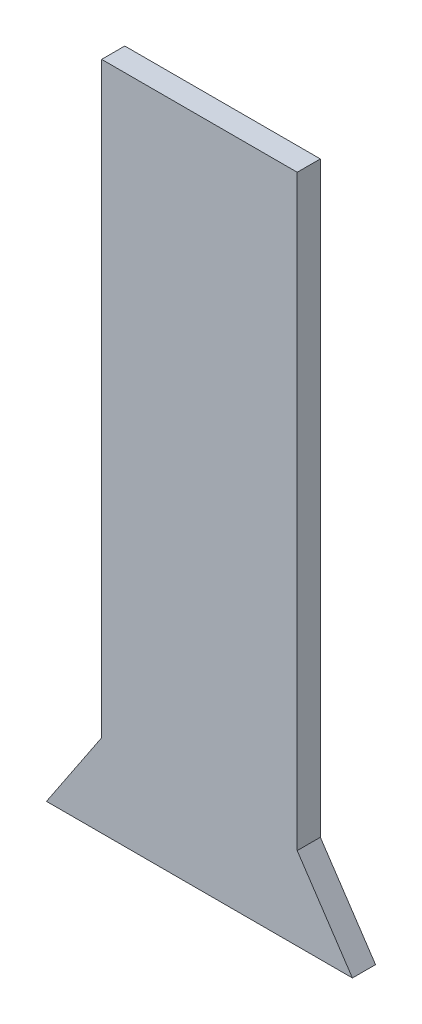
ISO-10303-21;
HEADER;
FILE_DESCRIPTION(('STEP AP214'),'2;1');
FILE_NAME('part.step','',(''),(''),'','','');
FILE_SCHEMA(('AUTOMOTIVE_DESIGN { 1 0 10303 214 1 1 1 1 }'));
ENDSEC;
DATA;
#1=APPLICATION_CONTEXT('core data for automotive mechanical design processes');
#2=APPLICATION_PROTOCOL_DEFINITION('international standard','automotive_design',2000,#1);
#3=PRODUCT_CONTEXT('',#1,'mechanical');
#4=PRODUCT('Part','Part','',(#3));
#5=PRODUCT_RELATED_PRODUCT_CATEGORY('part','',(#4));
#6=PRODUCT_DEFINITION_FORMATION('','',#4);
#7=PRODUCT_DEFINITION_CONTEXT('part definition',#1,'design');
#8=PRODUCT_DEFINITION('design','',#6,#7);
#9=PRODUCT_DEFINITION_SHAPE('','',#8);
#10=(LENGTH_UNIT() NAMED_UNIT(*) SI_UNIT(.MILLI.,.METRE.));
#11=(NAMED_UNIT(*) PLANE_ANGLE_UNIT() SI_UNIT($,.RADIAN.));
#12=(NAMED_UNIT(*) SI_UNIT($,.STERADIAN.) SOLID_ANGLE_UNIT());
#13=UNCERTAINTY_MEASURE_WITH_UNIT(LENGTH_MEASURE(1.E-05),#10,'distance_accuracy_value','');
#14=(GEOMETRIC_REPRESENTATION_CONTEXT(3) GLOBAL_UNCERTAINTY_ASSIGNED_CONTEXT((#13)) GLOBAL_UNIT_ASSIGNED_CONTEXT((#10,
#11,#12)) REPRESENTATION_CONTEXT('',''));
#15=CARTESIAN_POINT('',(0.,0.,0.));
#16=DIRECTION('',(0.,0.,1.));
#17=DIRECTION('',(1.,0.,0.));
#18=AXIS2_PLACEMENT_3D('',#15,#16,#17);
#19=CARTESIAN_POINT('',(2.0733173076923,2.28966346153846,0.5));
#20=DIRECTION('',(-0.831783322825491,-0.555100444847043,0.));
#21=DIRECTION('',(0.555100444847043,-0.831783322825491,0.));
#22=AXIS2_PLACEMENT_3D('',#19,#20,#21);
#23=PLANE('',#22);
#24=DIRECTION('',(0.555100444847043,-0.831783322825491,0.));
#25=VECTOR('',#24,1.);
#26=CARTESIAN_POINT('',(2.0733173076923,2.28966346153846,1.));
#27=LINE('',#26,#25);
#28=CARTESIAN_POINT('',(2.0733173076923,2.28966346153846,1.));
#29=VERTEX_POINT('',#28);
#30=CARTESIAN_POINT('',(3.26767039985561,0.5,1.));
#31=VERTEX_POINT('',#30);
#32=EDGE_CURVE('E43',#29,#31,#27,.T.);
#33=ORIENTED_EDGE('',*,*,#32,.T.);
#34=DIRECTION('',(0.,0.,-1.));
#35=VECTOR('',#34,1.);
#36=CARTESIAN_POINT('',(3.26767039985561,0.5,0.5));
#37=LINE('',#36,#35);
#38=CARTESIAN_POINT('',(3.26767039985561,0.5,0.5));
#39=VERTEX_POINT('',#38);
#40=EDGE_CURVE('E60',#31,#39,#37,.T.);
#41=ORIENTED_EDGE('',*,*,#40,.T.);
#42=DIRECTION('',(0.555100444847043,-0.831783322825491,0.));
#43=VECTOR('',#42,1.);
#44=CARTESIAN_POINT('',(2.0733173076923,2.28966346153846,0.5));
#45=LINE('',#44,#43);
#46=CARTESIAN_POINT('',(2.0733173076923,2.28966346153846,0.5));
#47=VERTEX_POINT('',#46);
#48=EDGE_CURVE('E106',#47,#39,#45,.T.);
#49=ORIENTED_EDGE('',*,*,#48,.F.);
#50=DIRECTION('',(0.,0.,1.));
#51=VECTOR('',#50,1.);
#52=CARTESIAN_POINT('',(2.0733173076923,2.28966346153846,0.5));
#53=LINE('',#52,#51);
#54=EDGE_CURVE('E103',#47,#29,#53,.T.);
#55=ORIENTED_EDGE('',*,*,#54,.T.);
#56=EDGE_LOOP('',(#33,#41,#49,#55));
#57=FACE_BOUND('',#56,.T.);
#58=ADVANCED_FACE('F39',(#57),#23,.F.);
#59=CARTESIAN_POINT('',(-13.6959134615385,-15.,0.5));
#60=DIRECTION('',(0.831783322825491,-0.555100444847043,0.));
#61=DIRECTION('',(0.555100444847043,0.831783322825491,0.));
#62=AXIS2_PLACEMENT_3D('',#59,#60,#61);
#63=PLANE('',#62);
#64=DIRECTION('',(0.555100444847043,0.831783322825491,0.));
#65=VECTOR('',#64,1.);
#66=CARTESIAN_POINT('',(-13.6959134615385,-15.,0.5));
#67=LINE('',#66,#65);
#68=CARTESIAN_POINT('',(-3.35180501524024,0.500000000000002,0.5));
#69=VERTEX_POINT('',#68);
#70=CARTESIAN_POINT('',(-2.15745192307693,2.28966346153846,0.5));
#71=VERTEX_POINT('',#70);
#72=EDGE_CURVE('E101',#69,#71,#67,.T.);
#73=ORIENTED_EDGE('',*,*,#72,.F.);
#74=DIRECTION('',(0.,0.,1.));
#75=VECTOR('',#74,1.);
#76=CARTESIAN_POINT('',(-3.35180501524024,0.499999999999999,0.5));
#77=LINE('',#76,#75);
#78=CARTESIAN_POINT('',(-3.35180501524024,0.5,1.));
#79=VERTEX_POINT('',#78);
#80=EDGE_CURVE('E88',#69,#79,#77,.T.);
#81=ORIENTED_EDGE('',*,*,#80,.T.);
#82=DIRECTION('',(0.555100444847043,0.831783322825491,0.));
#83=VECTOR('',#82,1.);
#84=CARTESIAN_POINT('',(-13.6959134615385,-15.,1.));
#85=LINE('',#84,#83);
#86=CARTESIAN_POINT('',(-2.15745192307693,2.28966346153846,1.));
#87=VERTEX_POINT('',#86);
#88=EDGE_CURVE('E104',#79,#87,#85,.T.);
#89=ORIENTED_EDGE('',*,*,#88,.T.);
#90=DIRECTION('',(0.,0.,1.));
#91=VECTOR('',#90,1.);
#92=CARTESIAN_POINT('',(-2.15745192307693,2.28966346153846,0.5));
#93=LINE('',#92,#91);
#94=EDGE_CURVE('E11',#71,#87,#93,.T.);
#95=ORIENTED_EDGE('',*,*,#94,.F.);
#96=EDGE_LOOP('',(#73,#81,#89,#95));
#97=FACE_BOUND('',#96,.T.);
#98=ADVANCED_FACE('F102',(#97),#63,.F.);
#99=CARTESIAN_POINT('',(1.37262654898482,-3.59519909686313,0.5));
#100=DIRECTION('',(0.,0.,1.));
#101=DIRECTION('',(1.,0.,0.));
#102=AXIS2_PLACEMENT_3D('',#99,#100,#101);
#103=PLANE('',#102);
#104=ORIENTED_EDGE('',*,*,#48,.T.);
#105=DIRECTION('',(-1.,0.,0.));
#106=VECTOR('',#105,1.);
#107=CARTESIAN_POINT('',(1.37262654898482,0.5,0.5));
#108=LINE('',#107,#106);
#109=EDGE_CURVE('E112',#39,#69,#108,.T.);
#110=ORIENTED_EDGE('',*,*,#109,.T.);
#111=ORIENTED_EDGE('',*,*,#72,.T.);
#112=DIRECTION('',(0.,1.,0.));
#113=VECTOR('',#112,1.);
#114=CARTESIAN_POINT('',(-2.15745192307693,2.28966346153846,0.5));
#115=LINE('',#114,#113);
#116=CARTESIAN_POINT('',(-2.15745192307693,15.,0.5));
#117=VERTEX_POINT('',#116);
#118=EDGE_CURVE('E114',#71,#117,#115,.T.);
#119=ORIENTED_EDGE('',*,*,#118,.T.);
#120=DIRECTION('',(1.,0.,0.));
#121=VECTOR('',#120,1.);
#122=CARTESIAN_POINT('',(-2.15745192307693,15.,0.5));
#123=LINE('',#122,#121);
#124=CARTESIAN_POINT('',(2.0733173076923,15.,0.5));
#125=VERTEX_POINT('',#124);
#126=EDGE_CURVE('E120',#117,#125,#123,.T.);
#127=ORIENTED_EDGE('',*,*,#126,.T.);
#128=DIRECTION('',(0.,-1.,0.));
#129=VECTOR('',#128,1.);
#130=CARTESIAN_POINT('',(2.0733173076923,15.,0.5));
#131=LINE('',#130,#129);
#132=EDGE_CURVE('E100',#125,#47,#131,.T.);
#133=ORIENTED_EDGE('',*,*,#132,.T.);
#134=EDGE_LOOP('',(#104,#110,#111,#119,#127,#133));
#135=FACE_BOUND('',#134,.T.);
#136=ADVANCED_FACE('F147',(#135),#103,.F.);
#137=CARTESIAN_POINT('',(1.37262654898482,-3.59519909686313,1.));
#138=DIRECTION('',(0.,0.,1.));
#139=DIRECTION('',(1.,0.,0.));
#140=AXIS2_PLACEMENT_3D('',#137,#138,#139);
#141=PLANE('',#140);
#142=ORIENTED_EDGE('',*,*,#88,.F.);
#143=DIRECTION('',(1.,0.,0.));
#144=VECTOR('',#143,1.);
#145=CARTESIAN_POINT('',(-17.,0.5,1.));
#146=LINE('',#145,#144);
#147=EDGE_CURVE('E89',#79,#31,#146,.T.);
#148=ORIENTED_EDGE('',*,*,#147,.T.);
#149=ORIENTED_EDGE('',*,*,#32,.F.);
#150=DIRECTION('',(0.,-1.,0.));
#151=VECTOR('',#150,1.);
#152=CARTESIAN_POINT('',(2.0733173076923,15.,1.));
#153=LINE('',#152,#151);
#154=CARTESIAN_POINT('',(2.0733173076923,15.,1.));
#155=VERTEX_POINT('',#154);
#156=EDGE_CURVE('E128',#155,#29,#153,.T.);
#157=ORIENTED_EDGE('',*,*,#156,.F.);
#158=DIRECTION('',(1.,0.,0.));
#159=VECTOR('',#158,1.);
#160=CARTESIAN_POINT('',(-2.15745192307693,15.,1.));
#161=LINE('',#160,#159);
#162=CARTESIAN_POINT('',(-2.15745192307693,15.,1.));
#163=VERTEX_POINT('',#162);
#164=EDGE_CURVE('E96',#163,#155,#161,.T.);
#165=ORIENTED_EDGE('',*,*,#164,.F.);
#166=DIRECTION('',(0.,1.,0.));
#167=VECTOR('',#166,1.);
#168=CARTESIAN_POINT('',(-2.15745192307693,2.28966346153846,1.));
#169=LINE('',#168,#167);
#170=EDGE_CURVE('E47',#87,#163,#169,.T.);
#171=ORIENTED_EDGE('',*,*,#170,.F.);
#172=EDGE_LOOP('',(#142,#148,#149,#157,#165,#171));
#173=FACE_BOUND('',#172,.T.);
#174=ADVANCED_FACE('F41',(#173),#141,.T.);
#175=CARTESIAN_POINT('',(-2.15745192307693,15.,0.5));
#176=DIRECTION('',(0.,-1.,0.));
#177=DIRECTION('',(0.,0.,-1.));
#178=AXIS2_PLACEMENT_3D('',#175,#176,#177);
#179=PLANE('',#178);
#180=ORIENTED_EDGE('',*,*,#164,.T.);
#181=DIRECTION('',(0.,0.,1.));
#182=VECTOR('',#181,1.);
#183=CARTESIAN_POINT('',(2.0733173076923,15.,0.5));
#184=LINE('',#183,#182);
#185=EDGE_CURVE('E126',#125,#155,#184,.T.);
#186=ORIENTED_EDGE('',*,*,#185,.F.);
#187=ORIENTED_EDGE('',*,*,#126,.F.);
#188=DIRECTION('',(0.,0.,1.));
#189=VECTOR('',#188,1.);
#190=CARTESIAN_POINT('',(-2.15745192307693,15.,0.5));
#191=LINE('',#190,#189);
#192=EDGE_CURVE('E124',#117,#163,#191,.T.);
#193=ORIENTED_EDGE('',*,*,#192,.T.);
#194=EDGE_LOOP('',(#180,#186,#187,#193));
#195=FACE_BOUND('',#194,.T.);
#196=ADVANCED_FACE('F141',(#195),#179,.F.);
#197=CARTESIAN_POINT('',(2.0733173076923,15.,0.5));
#198=DIRECTION('',(-1.,0.,0.));
#199=DIRECTION('',(0.,0.,1.));
#200=AXIS2_PLACEMENT_3D('',#197,#198,#199);
#201=PLANE('',#200);
#202=ORIENTED_EDGE('',*,*,#156,.T.);
#203=ORIENTED_EDGE('',*,*,#54,.F.);
#204=ORIENTED_EDGE('',*,*,#132,.F.);
#205=ORIENTED_EDGE('',*,*,#185,.T.);
#206=EDGE_LOOP('',(#202,#203,#204,#205));
#207=FACE_BOUND('',#206,.T.);
#208=ADVANCED_FACE('F140',(#207),#201,.F.);
#209=CARTESIAN_POINT('',(-2.15745192307693,2.28966346153846,0.5));
#210=DIRECTION('',(1.,0.,0.));
#211=DIRECTION('',(0.,0.,-1.));
#212=AXIS2_PLACEMENT_3D('',#209,#210,#211);
#213=PLANE('',#212);
#214=ORIENTED_EDGE('',*,*,#170,.T.);
#215=ORIENTED_EDGE('',*,*,#192,.F.);
#216=ORIENTED_EDGE('',*,*,#118,.F.);
#217=ORIENTED_EDGE('',*,*,#94,.T.);
#218=EDGE_LOOP('',(#214,#215,#216,#217));
#219=FACE_BOUND('',#218,.T.);
#220=ADVANCED_FACE('F146',(#219),#213,.F.);
#221=CARTESIAN_POINT('',(-17.,0.5,1.));
#222=DIRECTION('',(0.,1.,0.));
#223=DIRECTION('',(0.,0.,1.));
#224=AXIS2_PLACEMENT_3D('',#221,#222,#223);
#225=PLANE('',#224);
#226=ORIENTED_EDGE('',*,*,#147,.F.);
#227=ORIENTED_EDGE('',*,*,#80,.F.);
#228=ORIENTED_EDGE('',*,*,#109,.F.);
#229=ORIENTED_EDGE('',*,*,#40,.F.);
#230=EDGE_LOOP('',(#226,#227,#228,#229));
#231=FACE_BOUND('',#230,.T.);
#232=ADVANCED_FACE('F91',(#231),#225,.F.);
#233=CLOSED_SHELL('',(#58,#98,#136,#174,#196,#208,#220,#232));
#234=MANIFOLD_SOLID_BREP('B2',#233);
#235=ADVANCED_BREP_SHAPE_REPRESENTATION('',(#18,#234),#14);
#236=SHAPE_DEFINITION_REPRESENTATION(#9,#235);
ENDSEC;
END-ISO-10303-21;
